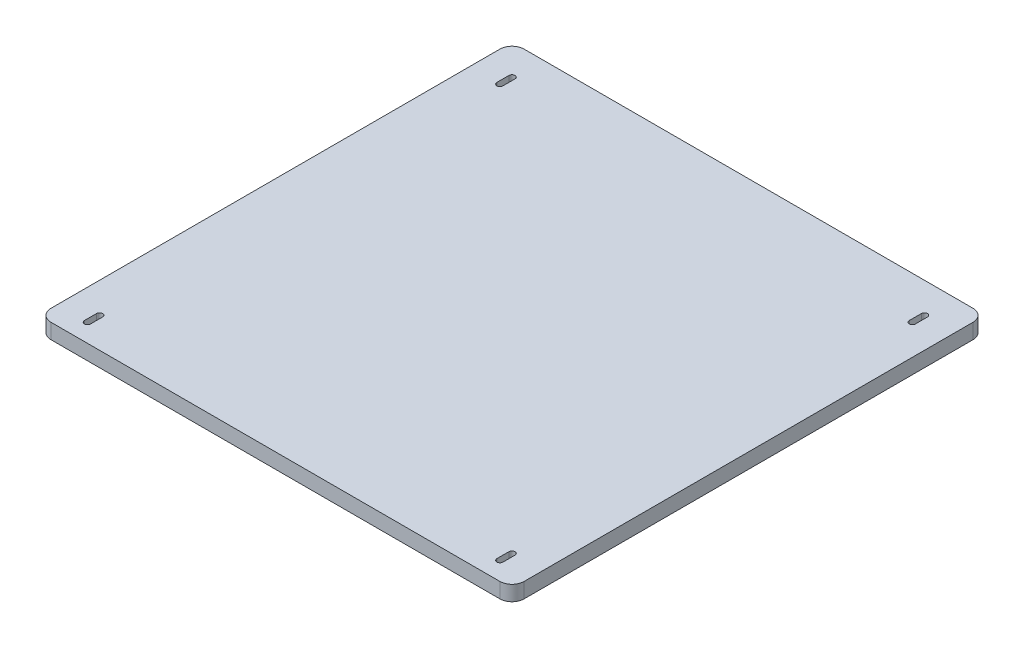
ISO-10303-21;
HEADER;
FILE_DESCRIPTION(('STEP AP214'),'2;1');
FILE_NAME('part.step','',(''),(''),'','','');
FILE_SCHEMA(('AUTOMOTIVE_DESIGN { 1 0 10303 214 1 1 1 1 }'));
ENDSEC;
DATA;
#1=APPLICATION_CONTEXT('core data for automotive mechanical design processes');
#2=APPLICATION_PROTOCOL_DEFINITION('international standard','automotive_design',2000,#1);
#3=PRODUCT_CONTEXT('',#1,'mechanical');
#4=PRODUCT('Part','Part','',(#3));
#5=PRODUCT_RELATED_PRODUCT_CATEGORY('part','',(#4));
#6=PRODUCT_DEFINITION_FORMATION('','',#4);
#7=PRODUCT_DEFINITION_CONTEXT('part definition',#1,'design');
#8=PRODUCT_DEFINITION('design','',#6,#7);
#9=PRODUCT_DEFINITION_SHAPE('','',#8);
#10=(LENGTH_UNIT() NAMED_UNIT(*) SI_UNIT(.MILLI.,.METRE.));
#11=(NAMED_UNIT(*) PLANE_ANGLE_UNIT() SI_UNIT($,.RADIAN.));
#12=(NAMED_UNIT(*) SI_UNIT($,.STERADIAN.) SOLID_ANGLE_UNIT());
#13=UNCERTAINTY_MEASURE_WITH_UNIT(LENGTH_MEASURE(1.E-05),#10,'distance_accuracy_value','');
#14=(GEOMETRIC_REPRESENTATION_CONTEXT(3) GLOBAL_UNCERTAINTY_ASSIGNED_CONTEXT((#13)) GLOBAL_UNIT_ASSIGNED_CONTEXT((#10,
#11,#12)) REPRESENTATION_CONTEXT('',''));
#15=CARTESIAN_POINT('',(0.,0.,0.));
#16=DIRECTION('',(0.,0.,1.));
#17=DIRECTION('',(1.,0.,0.));
#18=AXIS2_PLACEMENT_3D('',#15,#16,#17);
#19=CARTESIAN_POINT('',(0.,12.7,-198.501));
#20=DIRECTION('',(0.,0.,-1.));
#21=DIRECTION('',(-1.,0.,0.));
#22=AXIS2_PLACEMENT_3D('',#19,#20,#21);
#23=PLANE('',#22);
#24=DIRECTION('',(1.,0.,0.));
#25=VECTOR('',#24,1.);
#26=CARTESIAN_POINT('',(0.,0.,-198.501));
#27=LINE('',#26,#25);
#28=CARTESIAN_POINT('',(-188.341,0.,-198.501));
#29=VERTEX_POINT('',#28);
#30=CARTESIAN_POINT('',(188.341,0.,-198.501));
#31=VERTEX_POINT('',#30);
#32=EDGE_CURVE('E282',#29,#31,#27,.T.);
#33=ORIENTED_EDGE('',*,*,#32,.F.);
#34=DIRECTION('',(0.,-1.,0.));
#35=VECTOR('',#34,1.);
#36=CARTESIAN_POINT('',(-188.341,12.7,-198.501));
#37=LINE('',#36,#35);
#38=CARTESIAN_POINT('',(-188.341,12.7,-198.501));
#39=VERTEX_POINT('',#38);
#40=EDGE_CURVE('E11',#39,#29,#37,.T.);
#41=ORIENTED_EDGE('',*,*,#40,.F.);
#42=DIRECTION('',(1.,0.,0.));
#43=VECTOR('',#42,1.);
#44=CARTESIAN_POINT('',(0.,12.7,-198.501));
#45=LINE('',#44,#43);
#46=CARTESIAN_POINT('',(188.341,12.7,-198.501));
#47=VERTEX_POINT('',#46);
#48=EDGE_CURVE('E402',#39,#47,#45,.T.);
#49=ORIENTED_EDGE('',*,*,#48,.T.);
#50=DIRECTION('',(0.,-1.,0.));
#51=VECTOR('',#50,1.);
#52=CARTESIAN_POINT('',(188.341,12.7,-198.501));
#53=LINE('',#52,#51);
#54=EDGE_CURVE('E57',#47,#31,#53,.T.);
#55=ORIENTED_EDGE('',*,*,#54,.T.);
#56=EDGE_LOOP('',(#33,#41,#49,#55));
#57=FACE_BOUND('',#56,.T.);
#58=ADVANCED_FACE('F38',(#57),#23,.T.);
#59=CARTESIAN_POINT('',(-188.341,12.7,-188.341));
#60=DIRECTION('',(0.,-1.,0.));
#61=DIRECTION('',(0.,0.,-1.));
#62=AXIS2_PLACEMENT_3D('',#59,#60,#61);
#63=CYLINDRICAL_SURFACE('',#62,10.16);
#64=CARTESIAN_POINT('',(-188.341,0.,-188.341));
#65=DIRECTION('',(0.,1.,0.));
#66=DIRECTION('',(0.,0.,1.));
#67=AXIS2_PLACEMENT_3D('',#64,#65,#66);
#68=CIRCLE('',#67,10.16);
#69=CARTESIAN_POINT('',(-198.501,0.,-188.341));
#70=VERTEX_POINT('',#69);
#71=EDGE_CURVE('E284',#29,#70,#68,.T.);
#72=ORIENTED_EDGE('',*,*,#71,.T.);
#73=DIRECTION('',(0.,-1.,0.));
#74=VECTOR('',#73,1.);
#75=CARTESIAN_POINT('',(-198.501,12.7,-188.341));
#76=LINE('',#75,#74);
#77=CARTESIAN_POINT('',(-198.501,12.7,-188.341));
#78=VERTEX_POINT('',#77);
#79=EDGE_CURVE('E48',#78,#70,#76,.T.);
#80=ORIENTED_EDGE('',*,*,#79,.F.);
#81=CARTESIAN_POINT('',(-188.341,12.7,-188.341));
#82=DIRECTION('',(0.,1.,0.));
#83=DIRECTION('',(0.,0.,1.));
#84=AXIS2_PLACEMENT_3D('',#81,#82,#83);
#85=CIRCLE('',#84,10.16);
#86=EDGE_CURVE('E404',#39,#78,#85,.T.);
#87=ORIENTED_EDGE('',*,*,#86,.F.);
#88=ORIENTED_EDGE('',*,*,#40,.T.);
#89=EDGE_LOOP('',(#72,#80,#87,#88));
#90=FACE_BOUND('',#89,.T.);
#91=ADVANCED_FACE('F432',(#90),#63,.T.);
#92=CARTESIAN_POINT('',(-198.501,12.7,0.));
#93=DIRECTION('',(1.,0.,0.));
#94=DIRECTION('',(0.,0.,-1.));
#95=AXIS2_PLACEMENT_3D('',#92,#93,#94);
#96=PLANE('',#95);
#97=DIRECTION('',(0.,0.,1.));
#98=VECTOR('',#97,1.);
#99=CARTESIAN_POINT('',(-198.501,0.,0.));
#100=LINE('',#99,#98);
#101=CARTESIAN_POINT('',(-198.501,0.,188.341));
#102=VERTEX_POINT('',#101);
#103=EDGE_CURVE('E287',#70,#102,#100,.T.);
#104=ORIENTED_EDGE('',*,*,#103,.T.);
#105=DIRECTION('',(0.,-1.,0.));
#106=VECTOR('',#105,1.);
#107=CARTESIAN_POINT('',(-198.501,12.7,188.341));
#108=LINE('',#107,#106);
#109=CARTESIAN_POINT('',(-198.501,12.7,188.341));
#110=VERTEX_POINT('',#109);
#111=EDGE_CURVE('E310',#110,#102,#108,.T.);
#112=ORIENTED_EDGE('',*,*,#111,.F.);
#113=DIRECTION('',(0.,0.,1.));
#114=VECTOR('',#113,1.);
#115=CARTESIAN_POINT('',(-198.501,12.7,0.));
#116=LINE('',#115,#114);
#117=EDGE_CURVE('E407',#78,#110,#116,.T.);
#118=ORIENTED_EDGE('',*,*,#117,.F.);
#119=ORIENTED_EDGE('',*,*,#79,.T.);
#120=EDGE_LOOP('',(#104,#112,#118,#119));
#121=FACE_BOUND('',#120,.T.);
#122=ADVANCED_FACE('F437',(#121),#96,.F.);
#123=CARTESIAN_POINT('',(-188.341,12.7,188.341));
#124=DIRECTION('',(0.,-1.,0.));
#125=DIRECTION('',(0.,0.,-1.));
#126=AXIS2_PLACEMENT_3D('',#123,#124,#125);
#127=CYLINDRICAL_SURFACE('',#126,10.16);
#128=CARTESIAN_POINT('',(-188.341,0.,188.341));
#129=DIRECTION('',(0.,1.,0.));
#130=DIRECTION('',(0.,0.,1.));
#131=AXIS2_PLACEMENT_3D('',#128,#129,#130);
#132=CIRCLE('',#131,10.16);
#133=CARTESIAN_POINT('',(-188.341,0.,198.501));
#134=VERTEX_POINT('',#133);
#135=EDGE_CURVE('E290',#102,#134,#132,.T.);
#136=ORIENTED_EDGE('',*,*,#135,.T.);
#137=DIRECTION('',(0.,-1.,0.));
#138=VECTOR('',#137,1.);
#139=CARTESIAN_POINT('',(-188.341,12.7,198.501));
#140=LINE('',#139,#138);
#141=CARTESIAN_POINT('',(-188.341,12.7,198.501));
#142=VERTEX_POINT('',#141);
#143=EDGE_CURVE('E307',#142,#134,#140,.T.);
#144=ORIENTED_EDGE('',*,*,#143,.F.);
#145=CARTESIAN_POINT('',(-188.341,12.7,188.341));
#146=DIRECTION('',(0.,1.,0.));
#147=DIRECTION('',(0.,0.,1.));
#148=AXIS2_PLACEMENT_3D('',#145,#146,#147);
#149=CIRCLE('',#148,10.16);
#150=EDGE_CURVE('E410',#110,#142,#149,.T.);
#151=ORIENTED_EDGE('',*,*,#150,.F.);
#152=ORIENTED_EDGE('',*,*,#111,.T.);
#153=EDGE_LOOP('',(#136,#144,#151,#152));
#154=FACE_BOUND('',#153,.T.);
#155=ADVANCED_FACE('F414',(#154),#127,.T.);
#156=CARTESIAN_POINT('',(0.,12.7,198.501));
#157=DIRECTION('',(0.,0.,-1.));
#158=DIRECTION('',(-1.,0.,0.));
#159=AXIS2_PLACEMENT_3D('',#156,#157,#158);
#160=PLANE('',#159);
#161=DIRECTION('',(1.,0.,0.));
#162=VECTOR('',#161,1.);
#163=CARTESIAN_POINT('',(0.,0.,198.501));
#164=LINE('',#163,#162);
#165=CARTESIAN_POINT('',(188.341,0.,198.501));
#166=VERTEX_POINT('',#165);
#167=EDGE_CURVE('E293',#134,#166,#164,.T.);
#168=ORIENTED_EDGE('',*,*,#167,.T.);
#169=DIRECTION('',(0.,-1.,0.));
#170=VECTOR('',#169,1.);
#171=CARTESIAN_POINT('',(188.341,12.7,198.501));
#172=LINE('',#171,#170);
#173=CARTESIAN_POINT('',(188.341,12.7,198.501));
#174=VERTEX_POINT('',#173);
#175=EDGE_CURVE('E225',#174,#166,#172,.T.);
#176=ORIENTED_EDGE('',*,*,#175,.F.);
#177=DIRECTION('',(1.,0.,0.));
#178=VECTOR('',#177,1.);
#179=CARTESIAN_POINT('',(0.,12.7,198.501));
#180=LINE('',#179,#178);
#181=EDGE_CURVE('E214',#142,#174,#180,.T.);
#182=ORIENTED_EDGE('',*,*,#181,.F.);
#183=ORIENTED_EDGE('',*,*,#143,.T.);
#184=EDGE_LOOP('',(#168,#176,#182,#183));
#185=FACE_BOUND('',#184,.T.);
#186=ADVANCED_FACE('F416',(#185),#160,.F.);
#187=CARTESIAN_POINT('',(188.341,12.7,188.341));
#188=DIRECTION('',(0.,-1.,0.));
#189=DIRECTION('',(0.,0.,-1.));
#190=AXIS2_PLACEMENT_3D('',#187,#188,#189);
#191=CYLINDRICAL_SURFACE('',#190,10.16);
#192=CARTESIAN_POINT('',(188.341,0.,188.341));
#193=DIRECTION('',(0.,1.,0.));
#194=DIRECTION('',(0.,0.,1.));
#195=AXIS2_PLACEMENT_3D('',#192,#193,#194);
#196=CIRCLE('',#195,10.16);
#197=CARTESIAN_POINT('',(198.501,0.,188.341));
#198=VERTEX_POINT('',#197);
#199=EDGE_CURVE('E222',#166,#198,#196,.T.);
#200=ORIENTED_EDGE('',*,*,#199,.T.);
#201=DIRECTION('',(0.,-1.,0.));
#202=VECTOR('',#201,1.);
#203=CARTESIAN_POINT('',(198.501,12.7,188.341));
#204=LINE('',#203,#202);
#205=CARTESIAN_POINT('',(198.501,12.7,188.341));
#206=VERTEX_POINT('',#205);
#207=EDGE_CURVE('E220',#206,#198,#204,.T.);
#208=ORIENTED_EDGE('',*,*,#207,.F.);
#209=CARTESIAN_POINT('',(188.341,12.7,188.341));
#210=DIRECTION('',(0.,1.,0.));
#211=DIRECTION('',(0.,0.,1.));
#212=AXIS2_PLACEMENT_3D('',#209,#210,#211);
#213=CIRCLE('',#212,10.16);
#214=EDGE_CURVE('E206',#174,#206,#213,.T.);
#215=ORIENTED_EDGE('',*,*,#214,.F.);
#216=ORIENTED_EDGE('',*,*,#175,.T.);
#217=EDGE_LOOP('',(#200,#208,#215,#216));
#218=FACE_BOUND('',#217,.T.);
#219=ADVANCED_FACE('F221',(#218),#191,.T.);
#220=CARTESIAN_POINT('',(198.501,12.7,0.));
#221=DIRECTION('',(1.,0.,0.));
#222=DIRECTION('',(0.,0.,-1.));
#223=AXIS2_PLACEMENT_3D('',#220,#221,#222);
#224=PLANE('',#223);
#225=DIRECTION('',(0.,0.,1.));
#226=VECTOR('',#225,1.);
#227=CARTESIAN_POINT('',(198.501,0.,0.));
#228=LINE('',#227,#226);
#229=CARTESIAN_POINT('',(198.501,0.,-188.341));
#230=VERTEX_POINT('',#229);
#231=EDGE_CURVE('E297',#230,#198,#228,.T.);
#232=ORIENTED_EDGE('',*,*,#231,.F.);
#233=DIRECTION('',(0.,-1.,0.));
#234=VECTOR('',#233,1.);
#235=CARTESIAN_POINT('',(198.501,12.7,-188.341));
#236=LINE('',#235,#234);
#237=CARTESIAN_POINT('',(198.501,12.7,-188.341));
#238=VERTEX_POINT('',#237);
#239=EDGE_CURVE('E130',#238,#230,#236,.T.);
#240=ORIENTED_EDGE('',*,*,#239,.F.);
#241=DIRECTION('',(0.,0.,1.));
#242=VECTOR('',#241,1.);
#243=CARTESIAN_POINT('',(198.501,12.7,0.));
#244=LINE('',#243,#242);
#245=EDGE_CURVE('E212',#238,#206,#244,.T.);
#246=ORIENTED_EDGE('',*,*,#245,.T.);
#247=ORIENTED_EDGE('',*,*,#207,.T.);
#248=EDGE_LOOP('',(#232,#240,#246,#247));
#249=FACE_BOUND('',#248,.T.);
#250=ADVANCED_FACE('F227',(#249),#224,.T.);
#251=CARTESIAN_POINT('',(173.0375,12.7,-162.8775));
#252=DIRECTION('',(0.,-1.,0.));
#253=DIRECTION('',(0.,0.,-1.));
#254=AXIS2_PLACEMENT_3D('',#251,#252,#253);
#255=CYLINDRICAL_SURFACE('',#254,2.54000000000011);
#256=CARTESIAN_POINT('',(173.0375,0.,-162.8775));
#257=DIRECTION('',(0.,1.,0.));
#258=DIRECTION('',(0.,0.,1.));
#259=AXIS2_PLACEMENT_3D('',#256,#257,#258);
#260=CIRCLE('',#259,2.54000000000011);
#261=CARTESIAN_POINT('',(170.4975,0.,-162.8775));
#262=VERTEX_POINT('',#261);
#263=CARTESIAN_POINT('',(175.5775,0.,-162.8775));
#264=VERTEX_POINT('',#263);
#265=EDGE_CURVE('E270',#262,#264,#260,.T.);
#266=ORIENTED_EDGE('',*,*,#265,.F.);
#267=DIRECTION('',(0.,-1.,0.));
#268=VECTOR('',#267,1.);
#269=CARTESIAN_POINT('',(170.4975,12.7,-162.8775));
#270=LINE('',#269,#268);
#271=CARTESIAN_POINT('',(170.4975,12.7,-162.8775));
#272=VERTEX_POINT('',#271);
#273=EDGE_CURVE('E304',#272,#262,#270,.T.);
#274=ORIENTED_EDGE('',*,*,#273,.F.);
#275=CARTESIAN_POINT('',(173.0375,12.7,-162.8775));
#276=DIRECTION('',(0.,1.,0.));
#277=DIRECTION('',(0.,0.,1.));
#278=AXIS2_PLACEMENT_3D('',#275,#276,#277);
#279=CIRCLE('',#278,2.54000000000011);
#280=CARTESIAN_POINT('',(175.5775,12.7,-162.8775));
#281=VERTEX_POINT('',#280);
#282=EDGE_CURVE('E391',#272,#281,#279,.T.);
#283=ORIENTED_EDGE('',*,*,#282,.T.);
#284=DIRECTION('',(0.,-1.,0.));
#285=VECTOR('',#284,1.);
#286=CARTESIAN_POINT('',(175.5775,12.7,-162.8775));
#287=LINE('',#286,#285);
#288=EDGE_CURVE('E315',#281,#264,#287,.T.);
#289=ORIENTED_EDGE('',*,*,#288,.T.);
#290=EDGE_LOOP('',(#266,#274,#283,#289));
#291=FACE_BOUND('',#290,.T.);
#292=ADVANCED_FACE('F455',(#291),#255,.F.);
#293=CARTESIAN_POINT('',(170.4975,12.7,-4.65773253299771E-13));
#294=DIRECTION('',(1.,0.,0.));
#295=DIRECTION('',(0.,0.,-1.));
#296=AXIS2_PLACEMENT_3D('',#293,#294,#295);
#297=PLANE('',#296);
#298=DIRECTION('',(0.,0.,1.));
#299=VECTOR('',#298,1.);
#300=CARTESIAN_POINT('',(170.4975,0.,-4.65773253299771E-13));
#301=LINE('',#300,#299);
#302=CARTESIAN_POINT('',(170.4975,0.,-173.0375));
#303=VERTEX_POINT('',#302);
#304=EDGE_CURVE('E273',#303,#262,#301,.T.);
#305=ORIENTED_EDGE('',*,*,#304,.F.);
#306=DIRECTION('',(0.,-1.,0.));
#307=VECTOR('',#306,1.);
#308=CARTESIAN_POINT('',(170.4975,12.7,-173.0375));
#309=LINE('',#308,#307);
#310=CARTESIAN_POINT('',(170.4975,12.7,-173.0375));
#311=VERTEX_POINT('',#310);
#312=EDGE_CURVE('E320',#311,#303,#309,.T.);
#313=ORIENTED_EDGE('',*,*,#312,.F.);
#314=DIRECTION('',(0.,0.,1.));
#315=VECTOR('',#314,1.);
#316=CARTESIAN_POINT('',(170.4975,12.7,-4.65773253299771E-13));
#317=LINE('',#316,#315);
#318=EDGE_CURVE('E394',#311,#272,#317,.T.);
#319=ORIENTED_EDGE('',*,*,#318,.T.);
#320=ORIENTED_EDGE('',*,*,#273,.T.);
#321=EDGE_LOOP('',(#305,#313,#319,#320));
#322=FACE_BOUND('',#321,.T.);
#323=ADVANCED_FACE('F451',(#322),#297,.T.);
#324=CARTESIAN_POINT('',(173.0375,12.7,-173.0375));
#325=DIRECTION('',(0.,-1.,0.));
#326=DIRECTION('',(0.,0.,-1.));
#327=AXIS2_PLACEMENT_3D('',#324,#325,#326);
#328=CYLINDRICAL_SURFACE('',#327,2.54000000000004);
#329=CARTESIAN_POINT('',(173.0375,0.,-173.0375));
#330=DIRECTION('',(0.,1.,0.));
#331=DIRECTION('',(0.,0.,1.));
#332=AXIS2_PLACEMENT_3D('',#329,#330,#331);
#333=CIRCLE('',#332,2.54000000000004);
#334=CARTESIAN_POINT('',(175.5775,0.,-173.0375));
#335=VERTEX_POINT('',#334);
#336=EDGE_CURVE('E276',#335,#303,#333,.T.);
#337=ORIENTED_EDGE('',*,*,#336,.F.);
#338=DIRECTION('',(0.,-1.,0.));
#339=VECTOR('',#338,1.);
#340=CARTESIAN_POINT('',(175.5775,12.7,-173.0375));
#341=LINE('',#340,#339);
#342=CARTESIAN_POINT('',(175.5775,12.7,-173.0375));
#343=VERTEX_POINT('',#342);
#344=EDGE_CURVE('E317',#343,#335,#341,.T.);
#345=ORIENTED_EDGE('',*,*,#344,.F.);
#346=CARTESIAN_POINT('',(173.0375,12.7,-173.0375));
#347=DIRECTION('',(0.,1.,0.));
#348=DIRECTION('',(0.,0.,1.));
#349=AXIS2_PLACEMENT_3D('',#346,#347,#348);
#350=CIRCLE('',#349,2.54000000000004);
#351=EDGE_CURVE('E397',#343,#311,#350,.T.);
#352=ORIENTED_EDGE('',*,*,#351,.T.);
#353=ORIENTED_EDGE('',*,*,#312,.T.);
#354=EDGE_LOOP('',(#337,#345,#352,#353));
#355=FACE_BOUND('',#354,.T.);
#356=ADVANCED_FACE('F447',(#355),#328,.F.);
#357=CARTESIAN_POINT('',(-173.0375,12.7,183.1975));
#358=DIRECTION('',(0.,-1.,0.));
#359=DIRECTION('',(0.,0.,-1.));
#360=AXIS2_PLACEMENT_3D('',#357,#358,#359);
#361=CYLINDRICAL_SURFACE('',#360,2.53999999999996);
#362=CARTESIAN_POINT('',(-173.0375,0.,183.1975));
#363=DIRECTION('',(0.,1.,0.));
#364=DIRECTION('',(0.,0.,1.));
#365=AXIS2_PLACEMENT_3D('',#362,#363,#364);
#366=CIRCLE('',#365,2.53999999999996);
#367=CARTESIAN_POINT('',(-175.5775,0.,183.1975));
#368=VERTEX_POINT('',#367);
#369=CARTESIAN_POINT('',(-170.4975,0.,183.1975));
#370=VERTEX_POINT('',#369);
#371=EDGE_CURVE('E258',#368,#370,#366,.T.);
#372=ORIENTED_EDGE('',*,*,#371,.F.);
#373=DIRECTION('',(0.,-1.,0.));
#374=VECTOR('',#373,1.);
#375=CARTESIAN_POINT('',(-175.5775,12.7,183.1975));
#376=LINE('',#375,#374);
#377=CARTESIAN_POINT('',(-175.5775,12.7,183.1975));
#378=VERTEX_POINT('',#377);
#379=EDGE_CURVE('E318',#378,#368,#376,.T.);
#380=ORIENTED_EDGE('',*,*,#379,.F.);
#381=CARTESIAN_POINT('',(-173.0375,12.7,183.1975));
#382=DIRECTION('',(0.,1.,0.));
#383=DIRECTION('',(0.,0.,1.));
#384=AXIS2_PLACEMENT_3D('',#381,#382,#383);
#385=CIRCLE('',#384,2.53999999999996);
#386=CARTESIAN_POINT('',(-170.4975,12.7,183.1975));
#387=VERTEX_POINT('',#386);
#388=EDGE_CURVE('E380',#378,#387,#385,.T.);
#389=ORIENTED_EDGE('',*,*,#388,.T.);
#390=DIRECTION('',(0.,-1.,0.));
#391=VECTOR('',#390,1.);
#392=CARTESIAN_POINT('',(-170.4975,12.7,183.1975));
#393=LINE('',#392,#391);
#394=EDGE_CURVE('E323',#387,#370,#393,.T.);
#395=ORIENTED_EDGE('',*,*,#394,.T.);
#396=EDGE_LOOP('',(#372,#380,#389,#395));
#397=FACE_BOUND('',#396,.T.);
#398=ADVANCED_FACE('F450',(#397),#361,.F.);
#399=CARTESIAN_POINT('',(-175.577499999999,12.7,-9.59302082215179E-13));
#400=DIRECTION('',(1.,0.,0.));
#401=DIRECTION('',(0.,0.,-1.));
#402=AXIS2_PLACEMENT_3D('',#399,#400,#401);
#403=PLANE('',#402);
#404=DIRECTION('',(0.,0.,1.));
#405=VECTOR('',#404,1.);
#406=CARTESIAN_POINT('',(-175.577499999999,0.,-9.59302082215179E-13));
#407=LINE('',#406,#405);
#408=CARTESIAN_POINT('',(-175.5775,0.,173.0375));
#409=VERTEX_POINT('',#408);
#410=EDGE_CURVE('E261',#409,#368,#407,.T.);
#411=ORIENTED_EDGE('',*,*,#410,.F.);
#412=DIRECTION('',(0.,-1.,0.));
#413=VECTOR('',#412,1.);
#414=CARTESIAN_POINT('',(-175.5775,12.7,173.0375));
#415=LINE('',#414,#413);
#416=CARTESIAN_POINT('',(-175.5775,12.7,173.0375));
#417=VERTEX_POINT('',#416);
#418=EDGE_CURVE('E328',#417,#409,#415,.T.);
#419=ORIENTED_EDGE('',*,*,#418,.F.);
#420=DIRECTION('',(0.,0.,1.));
#421=VECTOR('',#420,1.);
#422=CARTESIAN_POINT('',(-175.577499999999,12.7,-9.59302082215179E-13));
#423=LINE('',#422,#421);
#424=EDGE_CURVE('E383',#417,#378,#423,.T.);
#425=ORIENTED_EDGE('',*,*,#424,.T.);
#426=ORIENTED_EDGE('',*,*,#379,.T.);
#427=EDGE_LOOP('',(#411,#419,#425,#426));
#428=FACE_BOUND('',#427,.T.);
#429=ADVANCED_FACE('F467',(#428),#403,.T.);
#430=CARTESIAN_POINT('',(-173.0375,12.7,173.0375));
#431=DIRECTION('',(0.,-1.,0.));
#432=DIRECTION('',(0.,0.,-1.));
#433=AXIS2_PLACEMENT_3D('',#430,#431,#432);
#434=CYLINDRICAL_SURFACE('',#433,2.54000000000001);
#435=CARTESIAN_POINT('',(-173.0375,0.,173.0375));
#436=DIRECTION('',(0.,1.,0.));
#437=DIRECTION('',(0.,0.,1.));
#438=AXIS2_PLACEMENT_3D('',#435,#436,#437);
#439=CIRCLE('',#438,2.54000000000001);
#440=CARTESIAN_POINT('',(-170.4975,0.,173.0375));
#441=VERTEX_POINT('',#440);
#442=EDGE_CURVE('E264',#441,#409,#439,.T.);
#443=ORIENTED_EDGE('',*,*,#442,.F.);
#444=DIRECTION('',(0.,-1.,0.));
#445=VECTOR('',#444,1.);
#446=CARTESIAN_POINT('',(-170.4975,12.7,173.0375));
#447=LINE('',#446,#445);
#448=CARTESIAN_POINT('',(-170.4975,12.7,173.0375));
#449=VERTEX_POINT('',#448);
#450=EDGE_CURVE('E325',#449,#441,#447,.T.);
#451=ORIENTED_EDGE('',*,*,#450,.F.);
#452=CARTESIAN_POINT('',(-173.0375,12.7,173.0375));
#453=DIRECTION('',(0.,1.,0.));
#454=DIRECTION('',(0.,0.,1.));
#455=AXIS2_PLACEMENT_3D('',#452,#453,#454);
#456=CIRCLE('',#455,2.54000000000001);
#457=EDGE_CURVE('E386',#449,#417,#456,.T.);
#458=ORIENTED_EDGE('',*,*,#457,.T.);
#459=ORIENTED_EDGE('',*,*,#418,.T.);
#460=EDGE_LOOP('',(#443,#451,#458,#459));
#461=FACE_BOUND('',#460,.T.);
#462=ADVANCED_FACE('F463',(#461),#434,.F.);
#463=CARTESIAN_POINT('',(-173.0375,12.7,-162.8775));
#464=DIRECTION('',(0.,-1.,0.));
#465=DIRECTION('',(0.,0.,-1.));
#466=AXIS2_PLACEMENT_3D('',#463,#464,#465);
#467=CYLINDRICAL_SURFACE('',#466,2.54000000000008);
#468=CARTESIAN_POINT('',(-173.0375,0.,-162.8775));
#469=DIRECTION('',(0.,1.,0.));
#470=DIRECTION('',(0.,0.,1.));
#471=AXIS2_PLACEMENT_3D('',#468,#469,#470);
#472=CIRCLE('',#471,2.54000000000008);
#473=CARTESIAN_POINT('',(-175.5775,0.,-162.8775));
#474=VERTEX_POINT('',#473);
#475=CARTESIAN_POINT('',(-170.4975,0.,-162.8775));
#476=VERTEX_POINT('',#475);
#477=EDGE_CURVE('E246',#474,#476,#472,.T.);
#478=ORIENTED_EDGE('',*,*,#477,.F.);
#479=DIRECTION('',(0.,-1.,0.));
#480=VECTOR('',#479,1.);
#481=CARTESIAN_POINT('',(-175.5775,12.7,-162.8775));
#482=LINE('',#481,#480);
#483=CARTESIAN_POINT('',(-175.5775,12.7,-162.8775));
#484=VERTEX_POINT('',#483);
#485=EDGE_CURVE('E326',#484,#474,#482,.T.);
#486=ORIENTED_EDGE('',*,*,#485,.F.);
#487=CARTESIAN_POINT('',(-173.0375,12.7,-162.8775));
#488=DIRECTION('',(0.,1.,0.));
#489=DIRECTION('',(0.,0.,1.));
#490=AXIS2_PLACEMENT_3D('',#487,#488,#489);
#491=CIRCLE('',#490,2.54000000000008);
#492=CARTESIAN_POINT('',(-170.4975,12.7,-162.8775));
#493=VERTEX_POINT('',#492);
#494=EDGE_CURVE('E363',#484,#493,#491,.T.);
#495=ORIENTED_EDGE('',*,*,#494,.T.);
#496=DIRECTION('',(0.,-1.,0.));
#497=VECTOR('',#496,1.);
#498=CARTESIAN_POINT('',(-170.4975,12.7,-162.8775));
#499=LINE('',#498,#497);
#500=EDGE_CURVE('E331',#493,#476,#499,.T.);
#501=ORIENTED_EDGE('',*,*,#500,.T.);
#502=EDGE_LOOP('',(#478,#486,#495,#501));
#503=FACE_BOUND('',#502,.T.);
#504=ADVANCED_FACE('F466',(#503),#467,.F.);
#505=CARTESIAN_POINT('',(-175.5775,12.7,0.));
#506=DIRECTION('',(1.,0.,0.));
#507=DIRECTION('',(0.,0.,-1.));
#508=AXIS2_PLACEMENT_3D('',#505,#506,#507);
#509=PLANE('',#508);
#510=DIRECTION('',(0.,0.,1.));
#511=VECTOR('',#510,1.);
#512=CARTESIAN_POINT('',(-175.5775,0.,0.));
#513=LINE('',#512,#511);
#514=CARTESIAN_POINT('',(-175.5775,0.,-173.0375));
#515=VERTEX_POINT('',#514);
#516=EDGE_CURVE('E249',#515,#474,#513,.T.);
#517=ORIENTED_EDGE('',*,*,#516,.F.);
#518=DIRECTION('',(0.,-1.,0.));
#519=VECTOR('',#518,1.);
#520=CARTESIAN_POINT('',(-175.5775,12.7,-173.0375));
#521=LINE('',#520,#519);
#522=CARTESIAN_POINT('',(-175.5775,12.7,-173.0375));
#523=VERTEX_POINT('',#522);
#524=EDGE_CURVE('E335',#523,#515,#521,.T.);
#525=ORIENTED_EDGE('',*,*,#524,.F.);
#526=DIRECTION('',(0.,0.,1.));
#527=VECTOR('',#526,1.);
#528=CARTESIAN_POINT('',(-175.5775,12.7,0.));
#529=LINE('',#528,#527);
#530=EDGE_CURVE('E372',#523,#484,#529,.T.);
#531=ORIENTED_EDGE('',*,*,#530,.T.);
#532=ORIENTED_EDGE('',*,*,#485,.T.);
#533=EDGE_LOOP('',(#517,#525,#531,#532));
#534=FACE_BOUND('',#533,.T.);
#535=ADVANCED_FACE('F481',(#534),#509,.T.);
#536=CARTESIAN_POINT('',(-173.0375,12.7,-173.0375));
#537=DIRECTION('',(0.,-1.,0.));
#538=DIRECTION('',(0.,0.,-1.));
#539=AXIS2_PLACEMENT_3D('',#536,#537,#538);
#540=CYLINDRICAL_SURFACE('',#539,2.54000000000001);
#541=CARTESIAN_POINT('',(-173.0375,0.,-173.0375));
#542=DIRECTION('',(0.,1.,0.));
#543=DIRECTION('',(0.,0.,1.));
#544=AXIS2_PLACEMENT_3D('',#541,#542,#543);
#545=CIRCLE('',#544,2.54000000000001);
#546=CARTESIAN_POINT('',(-170.4975,0.,-173.0375));
#547=VERTEX_POINT('',#546);
#548=EDGE_CURVE('E252',#547,#515,#545,.T.);
#549=ORIENTED_EDGE('',*,*,#548,.F.);
#550=DIRECTION('',(0.,-1.,0.));
#551=VECTOR('',#550,1.);
#552=CARTESIAN_POINT('',(-170.4975,12.7,-173.0375));
#553=LINE('',#552,#551);
#554=CARTESIAN_POINT('',(-170.4975,12.7,-173.0375));
#555=VERTEX_POINT('',#554);
#556=EDGE_CURVE('E333',#555,#547,#553,.T.);
#557=ORIENTED_EDGE('',*,*,#556,.F.);
#558=CARTESIAN_POINT('',(-173.0375,12.7,-173.0375));
#559=DIRECTION('',(0.,1.,0.));
#560=DIRECTION('',(0.,0.,1.));
#561=AXIS2_PLACEMENT_3D('',#558,#559,#560);
#562=CIRCLE('',#561,2.54000000000001);
#563=EDGE_CURVE('E375',#555,#523,#562,.T.);
#564=ORIENTED_EDGE('',*,*,#563,.T.);
#565=ORIENTED_EDGE('',*,*,#524,.T.);
#566=EDGE_LOOP('',(#549,#557,#564,#565));
#567=FACE_BOUND('',#566,.T.);
#568=ADVANCED_FACE('F478',(#567),#540,.F.);
#569=CARTESIAN_POINT('',(173.0375,12.7,183.1975));
#570=DIRECTION('',(0.,-1.,0.));
#571=DIRECTION('',(0.,0.,-1.));
#572=AXIS2_PLACEMENT_3D('',#569,#570,#571);
#573=CYLINDRICAL_SURFACE('',#572,2.53999999999996);
#574=CARTESIAN_POINT('',(173.0375,0.,183.1975));
#575=DIRECTION('',(0.,1.,0.));
#576=DIRECTION('',(0.,0.,1.));
#577=AXIS2_PLACEMENT_3D('',#574,#575,#576);
#578=CIRCLE('',#577,2.53999999999996);
#579=CARTESIAN_POINT('',(170.4975,0.,183.1975));
#580=VERTEX_POINT('',#579);
#581=CARTESIAN_POINT('',(175.5775,0.,183.1975));
#582=VERTEX_POINT('',#581);
#583=EDGE_CURVE('E234',#580,#582,#578,.T.);
#584=ORIENTED_EDGE('',*,*,#583,.F.);
#585=DIRECTION('',(0.,-1.,0.));
#586=VECTOR('',#585,1.);
#587=CARTESIAN_POINT('',(170.4975,12.7,183.1975));
#588=LINE('',#587,#586);
#589=CARTESIAN_POINT('',(170.4975,12.7,183.1975));
#590=VERTEX_POINT('',#589);
#591=EDGE_CURVE('E42',#590,#580,#588,.T.);
#592=ORIENTED_EDGE('',*,*,#591,.F.);
#593=CARTESIAN_POINT('',(173.0375,12.7,183.1975));
#594=DIRECTION('',(0.,1.,0.));
#595=DIRECTION('',(0.,0.,1.));
#596=AXIS2_PLACEMENT_3D('',#593,#594,#595);
#597=CIRCLE('',#596,2.53999999999996);
#598=CARTESIAN_POINT('',(175.5775,12.7,183.1975));
#599=VERTEX_POINT('',#598);
#600=EDGE_CURVE('E302',#590,#599,#597,.T.);
#601=ORIENTED_EDGE('',*,*,#600,.T.);
#602=DIRECTION('',(0.,-1.,0.));
#603=VECTOR('',#602,1.);
#604=CARTESIAN_POINT('',(175.5775,12.7,183.1975));
#605=LINE('',#604,#603);
#606=EDGE_CURVE('E230',#599,#582,#605,.T.);
#607=ORIENTED_EDGE('',*,*,#606,.T.);
#608=EDGE_LOOP('',(#584,#592,#601,#607));
#609=FACE_BOUND('',#608,.T.);
#610=ADVANCED_FACE('F40',(#609),#573,.F.);
#611=CARTESIAN_POINT('',(170.497499999997,12.7,-2.79463951979862E-12));
#612=DIRECTION('',(1.,0.,0.));
#613=DIRECTION('',(0.,0.,-1.));
#614=AXIS2_PLACEMENT_3D('',#611,#612,#613);
#615=PLANE('',#614);
#616=DIRECTION('',(0.,0.,1.));
#617=VECTOR('',#616,1.);
#618=CARTESIAN_POINT('',(170.497499999997,0.,-2.79463951979862E-12));
#619=LINE('',#618,#617);
#620=CARTESIAN_POINT('',(170.4975,0.,173.0375));
#621=VERTEX_POINT('',#620);
#622=EDGE_CURVE('E237',#621,#580,#619,.T.);
#623=ORIENTED_EDGE('',*,*,#622,.F.);
#624=DIRECTION('',(0.,-1.,0.));
#625=VECTOR('',#624,1.);
#626=CARTESIAN_POINT('',(170.4975,12.7,173.0375));
#627=LINE('',#626,#625);
#628=CARTESIAN_POINT('',(170.4975,12.7,173.0375));
#629=VERTEX_POINT('',#628);
#630=EDGE_CURVE('E340',#629,#621,#627,.T.);
#631=ORIENTED_EDGE('',*,*,#630,.F.);
#632=DIRECTION('',(0.,0.,1.));
#633=VECTOR('',#632,1.);
#634=CARTESIAN_POINT('',(170.497499999997,12.7,-2.79463951979862E-12));
#635=LINE('',#634,#633);
#636=EDGE_CURVE('E349',#629,#590,#635,.T.);
#637=ORIENTED_EDGE('',*,*,#636,.T.);
#638=ORIENTED_EDGE('',*,*,#591,.T.);
#639=EDGE_LOOP('',(#623,#631,#637,#638));
#640=FACE_BOUND('',#639,.T.);
#641=ADVANCED_FACE('F347',(#640),#615,.T.);
#642=CARTESIAN_POINT('',(173.0375,12.7,173.0375));
#643=DIRECTION('',(0.,-1.,0.));
#644=DIRECTION('',(0.,0.,-1.));
#645=AXIS2_PLACEMENT_3D('',#642,#643,#644);
#646=CYLINDRICAL_SURFACE('',#645,2.54000000000004);
#647=CARTESIAN_POINT('',(173.0375,0.,173.0375));
#648=DIRECTION('',(0.,1.,0.));
#649=DIRECTION('',(0.,0.,1.));
#650=AXIS2_PLACEMENT_3D('',#647,#648,#649);
#651=CIRCLE('',#650,2.54000000000004);
#652=CARTESIAN_POINT('',(175.5775,0.,173.0375));
#653=VERTEX_POINT('',#652);
#654=EDGE_CURVE('E240',#653,#621,#651,.T.);
#655=ORIENTED_EDGE('',*,*,#654,.F.);
#656=DIRECTION('',(0.,-1.,0.));
#657=VECTOR('',#656,1.);
#658=CARTESIAN_POINT('',(175.5775,12.7,173.0375));
#659=LINE('',#658,#657);
#660=CARTESIAN_POINT('',(175.5775,12.7,173.0375));
#661=VERTEX_POINT('',#660);
#662=EDGE_CURVE('E339',#661,#653,#659,.T.);
#663=ORIENTED_EDGE('',*,*,#662,.F.);
#664=CARTESIAN_POINT('',(173.0375,12.7,173.0375));
#665=DIRECTION('',(0.,1.,0.));
#666=DIRECTION('',(0.,0.,1.));
#667=AXIS2_PLACEMENT_3D('',#664,#665,#666);
#668=CIRCLE('',#667,2.54000000000004);
#669=EDGE_CURVE('E358',#661,#629,#668,.T.);
#670=ORIENTED_EDGE('',*,*,#669,.T.);
#671=ORIENTED_EDGE('',*,*,#630,.T.);
#672=EDGE_LOOP('',(#655,#663,#670,#671));
#673=FACE_BOUND('',#672,.T.);
#674=ADVANCED_FACE('F355',(#673),#646,.F.);
#675=CARTESIAN_POINT('',(175.577500000003,12.7,-2.87790624664555E-12));
#676=DIRECTION('',(1.,0.,0.));
#677=DIRECTION('',(0.,0.,-1.));
#678=AXIS2_PLACEMENT_3D('',#675,#676,#677);
#679=PLANE('',#678);
#680=DIRECTION('',(0.,0.,1.));
#681=VECTOR('',#680,1.);
#682=CARTESIAN_POINT('',(175.577500000003,0.,-2.87790624664555E-12));
#683=LINE('',#682,#681);
#684=EDGE_CURVE('E279',#335,#264,#683,.T.);
#685=ORIENTED_EDGE('',*,*,#684,.T.);
#686=ORIENTED_EDGE('',*,*,#288,.F.);
#687=DIRECTION('',(0.,0.,1.));
#688=VECTOR('',#687,1.);
#689=CARTESIAN_POINT('',(175.577500000003,12.7,-2.87790624664555E-12));
#690=LINE('',#689,#688);
#691=EDGE_CURVE('E400',#343,#281,#690,.T.);
#692=ORIENTED_EDGE('',*,*,#691,.F.);
#693=ORIENTED_EDGE('',*,*,#344,.T.);
#694=EDGE_LOOP('',(#685,#686,#692,#693));
#695=FACE_BOUND('',#694,.T.);
#696=ADVANCED_FACE('F442',(#695),#679,.F.);
#697=CARTESIAN_POINT('',(-170.497499999997,12.7,-2.79463951979862E-12));
#698=DIRECTION('',(1.,0.,0.));
#699=DIRECTION('',(0.,0.,-1.));
#700=AXIS2_PLACEMENT_3D('',#697,#698,#699);
#701=PLANE('',#700);
#702=DIRECTION('',(0.,0.,1.));
#703=VECTOR('',#702,1.);
#704=CARTESIAN_POINT('',(-170.497499999997,0.,-2.79463951979862E-12));
#705=LINE('',#704,#703);
#706=EDGE_CURVE('E267',#441,#370,#705,.T.);
#707=ORIENTED_EDGE('',*,*,#706,.T.);
#708=ORIENTED_EDGE('',*,*,#394,.F.);
#709=DIRECTION('',(0.,0.,1.));
#710=VECTOR('',#709,1.);
#711=CARTESIAN_POINT('',(-170.497499999997,12.7,-2.79463951979862E-12));
#712=LINE('',#711,#710);
#713=EDGE_CURVE('E389',#449,#387,#712,.T.);
#714=ORIENTED_EDGE('',*,*,#713,.F.);
#715=ORIENTED_EDGE('',*,*,#450,.T.);
#716=EDGE_LOOP('',(#707,#708,#714,#715));
#717=FACE_BOUND('',#716,.T.);
#718=ADVANCED_FACE('F445',(#717),#701,.F.);
#719=CARTESIAN_POINT('',(-170.497499999998,12.7,2.32886626649883E-12));
#720=DIRECTION('',(1.,0.,0.));
#721=DIRECTION('',(0.,0.,-1.));
#722=AXIS2_PLACEMENT_3D('',#719,#720,#721);
#723=PLANE('',#722);
#724=DIRECTION('',(0.,0.,1.));
#725=VECTOR('',#724,1.);
#726=CARTESIAN_POINT('',(-170.497499999998,0.,2.32886626649883E-12));
#727=LINE('',#726,#725);
#728=EDGE_CURVE('E255',#547,#476,#727,.T.);
#729=ORIENTED_EDGE('',*,*,#728,.T.);
#730=ORIENTED_EDGE('',*,*,#500,.F.);
#731=DIRECTION('',(0.,0.,1.));
#732=VECTOR('',#731,1.);
#733=CARTESIAN_POINT('',(-170.497499999998,12.7,2.32886626649883E-12));
#734=LINE('',#733,#732);
#735=EDGE_CURVE('E378',#555,#493,#734,.T.);
#736=ORIENTED_EDGE('',*,*,#735,.F.);
#737=ORIENTED_EDGE('',*,*,#556,.T.);
#738=EDGE_LOOP('',(#729,#730,#736,#737));
#739=FACE_BOUND('',#738,.T.);
#740=ADVANCED_FACE('F427',(#739),#723,.F.);
#741=CARTESIAN_POINT('',(175.5775,12.7,0.));
#742=DIRECTION('',(1.,0.,0.));
#743=DIRECTION('',(0.,0.,-1.));
#744=AXIS2_PLACEMENT_3D('',#741,#742,#743);
#745=PLANE('',#744);
#746=DIRECTION('',(0.,0.,1.));
#747=VECTOR('',#746,1.);
#748=CARTESIAN_POINT('',(175.5775,0.,0.));
#749=LINE('',#748,#747);
#750=EDGE_CURVE('E243',#653,#582,#749,.T.);
#751=ORIENTED_EDGE('',*,*,#750,.T.);
#752=ORIENTED_EDGE('',*,*,#606,.F.);
#753=DIRECTION('',(0.,0.,1.));
#754=VECTOR('',#753,1.);
#755=CARTESIAN_POINT('',(175.5775,12.7,0.));
#756=LINE('',#755,#754);
#757=EDGE_CURVE('E360',#661,#599,#756,.T.);
#758=ORIENTED_EDGE('',*,*,#757,.F.);
#759=ORIENTED_EDGE('',*,*,#662,.T.);
#760=EDGE_LOOP('',(#751,#752,#758,#759));
#761=FACE_BOUND('',#760,.T.);
#762=ADVANCED_FACE('F361',(#761),#745,.F.);
#763=CARTESIAN_POINT('',(188.341,12.7,-188.341));
#764=DIRECTION('',(0.,-1.,0.));
#765=DIRECTION('',(0.,0.,-1.));
#766=AXIS2_PLACEMENT_3D('',#763,#764,#765);
#767=CYLINDRICAL_SURFACE('',#766,10.16);
#768=CARTESIAN_POINT('',(188.341,0.,-188.341));
#769=DIRECTION('',(0.,1.,0.));
#770=DIRECTION('',(0.,0.,1.));
#771=AXIS2_PLACEMENT_3D('',#768,#769,#770);
#772=CIRCLE('',#771,10.16);
#773=EDGE_CURVE('E299',#31,#230,#772,.F.);
#774=ORIENTED_EDGE('',*,*,#773,.F.);
#775=ORIENTED_EDGE('',*,*,#54,.F.);
#776=CARTESIAN_POINT('',(188.341,12.7,-188.341));
#777=DIRECTION('',(0.,1.,0.));
#778=DIRECTION('',(0.,0.,1.));
#779=AXIS2_PLACEMENT_3D('',#776,#777,#778);
#780=CIRCLE('',#779,10.16);
#781=EDGE_CURVE('E228',#47,#238,#780,.F.);
#782=ORIENTED_EDGE('',*,*,#781,.T.);
#783=ORIENTED_EDGE('',*,*,#239,.T.);
#784=EDGE_LOOP('',(#774,#775,#782,#783));
#785=FACE_BOUND('',#784,.T.);
#786=ADVANCED_FACE('F419',(#785),#767,.T.);
#787=CARTESIAN_POINT('',(0.,12.7,0.));
#788=DIRECTION('',(0.,1.,0.));
#789=DIRECTION('',(0.,0.,1.));
#790=AXIS2_PLACEMENT_3D('',#787,#788,#789);
#791=PLANE('',#790);
#792=ORIENTED_EDGE('',*,*,#600,.F.);
#793=ORIENTED_EDGE('',*,*,#636,.F.);
#794=ORIENTED_EDGE('',*,*,#669,.F.);
#795=ORIENTED_EDGE('',*,*,#757,.T.);
#796=EDGE_LOOP('',(#792,#793,#794,#795));
#797=FACE_BOUND('',#796,.T.);
#798=ORIENTED_EDGE('',*,*,#494,.F.);
#799=ORIENTED_EDGE('',*,*,#530,.F.);
#800=ORIENTED_EDGE('',*,*,#563,.F.);
#801=ORIENTED_EDGE('',*,*,#735,.T.);
#802=EDGE_LOOP('',(#798,#799,#800,#801));
#803=FACE_BOUND('',#802,.T.);
#804=ORIENTED_EDGE('',*,*,#388,.F.);
#805=ORIENTED_EDGE('',*,*,#424,.F.);
#806=ORIENTED_EDGE('',*,*,#457,.F.);
#807=ORIENTED_EDGE('',*,*,#713,.T.);
#808=EDGE_LOOP('',(#804,#805,#806,#807));
#809=FACE_BOUND('',#808,.T.);
#810=ORIENTED_EDGE('',*,*,#282,.F.);
#811=ORIENTED_EDGE('',*,*,#318,.F.);
#812=ORIENTED_EDGE('',*,*,#351,.F.);
#813=ORIENTED_EDGE('',*,*,#691,.T.);
#814=EDGE_LOOP('',(#810,#811,#812,#813));
#815=FACE_BOUND('',#814,.T.);
#816=ORIENTED_EDGE('',*,*,#48,.F.);
#817=ORIENTED_EDGE('',*,*,#86,.T.);
#818=ORIENTED_EDGE('',*,*,#117,.T.);
#819=ORIENTED_EDGE('',*,*,#150,.T.);
#820=ORIENTED_EDGE('',*,*,#181,.T.);
#821=ORIENTED_EDGE('',*,*,#214,.T.);
#822=ORIENTED_EDGE('',*,*,#245,.F.);
#823=ORIENTED_EDGE('',*,*,#781,.F.);
#824=EDGE_LOOP('',(#816,#817,#818,#819,#820,#821,#822,#823));
#825=FACE_BOUND('',#824,.T.);
#826=ADVANCED_FACE('F209',(#797,#803,#809,#815,#825),#791,.T.);
#827=CARTESIAN_POINT('',(0.,0.,0.));
#828=DIRECTION('',(0.,1.,0.));
#829=DIRECTION('',(0.,0.,1.));
#830=AXIS2_PLACEMENT_3D('',#827,#828,#829);
#831=PLANE('',#830);
#832=ORIENTED_EDGE('',*,*,#583,.T.);
#833=ORIENTED_EDGE('',*,*,#750,.F.);
#834=ORIENTED_EDGE('',*,*,#654,.T.);
#835=ORIENTED_EDGE('',*,*,#622,.T.);
#836=EDGE_LOOP('',(#832,#833,#834,#835));
#837=FACE_BOUND('',#836,.T.);
#838=ORIENTED_EDGE('',*,*,#477,.T.);
#839=ORIENTED_EDGE('',*,*,#728,.F.);
#840=ORIENTED_EDGE('',*,*,#548,.T.);
#841=ORIENTED_EDGE('',*,*,#516,.T.);
#842=EDGE_LOOP('',(#838,#839,#840,#841));
#843=FACE_BOUND('',#842,.T.);
#844=ORIENTED_EDGE('',*,*,#371,.T.);
#845=ORIENTED_EDGE('',*,*,#706,.F.);
#846=ORIENTED_EDGE('',*,*,#442,.T.);
#847=ORIENTED_EDGE('',*,*,#410,.T.);
#848=EDGE_LOOP('',(#844,#845,#846,#847));
#849=FACE_BOUND('',#848,.T.);
#850=ORIENTED_EDGE('',*,*,#265,.T.);
#851=ORIENTED_EDGE('',*,*,#684,.F.);
#852=ORIENTED_EDGE('',*,*,#336,.T.);
#853=ORIENTED_EDGE('',*,*,#304,.T.);
#854=EDGE_LOOP('',(#850,#851,#852,#853));
#855=FACE_BOUND('',#854,.T.);
#856=ORIENTED_EDGE('',*,*,#32,.T.);
#857=ORIENTED_EDGE('',*,*,#773,.T.);
#858=ORIENTED_EDGE('',*,*,#231,.T.);
#859=ORIENTED_EDGE('',*,*,#199,.F.);
#860=ORIENTED_EDGE('',*,*,#167,.F.);
#861=ORIENTED_EDGE('',*,*,#135,.F.);
#862=ORIENTED_EDGE('',*,*,#103,.F.);
#863=ORIENTED_EDGE('',*,*,#71,.F.);
#864=EDGE_LOOP('',(#856,#857,#858,#859,#860,#861,#862,#863));
#865=FACE_BOUND('',#864,.T.);
#866=ADVANCED_FACE('F353',(#837,#843,#849,#855,#865),#831,.F.);
#867=CLOSED_SHELL('',(#58,#91,#122,#155,#186,#219,#250,#292,#323,#356,#398,#429,#462,#504,#535,
#568,#610,#641,#674,#696,#718,#740,#762,#786,#826,#866));
#868=MANIFOLD_SOLID_BREP('B2',#867);
#869=ADVANCED_BREP_SHAPE_REPRESENTATION('',(#18,#868),#14);
#870=SHAPE_DEFINITION_REPRESENTATION(#9,#869);
ENDSEC;
END-ISO-10303-21;
